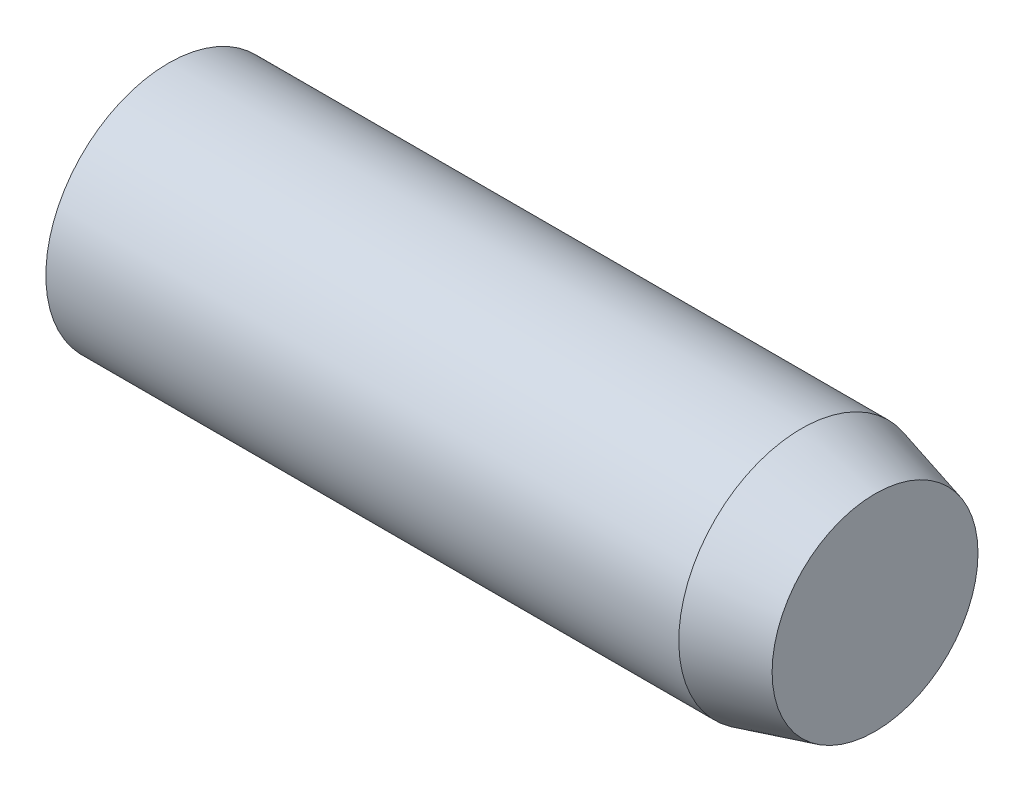
ISO-10303-21;
HEADER;
FILE_DESCRIPTION(('STEP AP214'),'2;1');
FILE_NAME('part.step','',(''),(''),'','','');
FILE_SCHEMA(('AUTOMOTIVE_DESIGN { 1 0 10303 214 1 1 1 1 }'));
ENDSEC;
DATA;
#1=APPLICATION_CONTEXT('core data for automotive mechanical design processes');
#2=APPLICATION_PROTOCOL_DEFINITION('international standard','automotive_design',2000,#1);
#3=PRODUCT_CONTEXT('',#1,'mechanical');
#4=PRODUCT('Part','Part','',(#3));
#5=PRODUCT_RELATED_PRODUCT_CATEGORY('part','',(#4));
#6=PRODUCT_DEFINITION_FORMATION('','',#4);
#7=PRODUCT_DEFINITION_CONTEXT('part definition',#1,'design');
#8=PRODUCT_DEFINITION('design','',#6,#7);
#9=PRODUCT_DEFINITION_SHAPE('','',#8);
#10=(LENGTH_UNIT() NAMED_UNIT(*) SI_UNIT(.MILLI.,.METRE.));
#11=(NAMED_UNIT(*) PLANE_ANGLE_UNIT() SI_UNIT($,.RADIAN.));
#12=(NAMED_UNIT(*) SI_UNIT($,.STERADIAN.) SOLID_ANGLE_UNIT());
#13=UNCERTAINTY_MEASURE_WITH_UNIT(LENGTH_MEASURE(1.E-05),#10,'distance_accuracy_value','');
#14=(GEOMETRIC_REPRESENTATION_CONTEXT(3) GLOBAL_UNCERTAINTY_ASSIGNED_CONTEXT((#13)) GLOBAL_UNIT_ASSIGNED_CONTEXT((#10,
#11,#12)) REPRESENTATION_CONTEXT('',''));
#15=CARTESIAN_POINT('',(0.,0.,0.));
#16=DIRECTION('',(0.,0.,1.));
#17=DIRECTION('',(1.,0.,0.));
#18=AXIS2_PLACEMENT_3D('',#15,#16,#17);
#19=CARTESIAN_POINT('',(30.,4.19615242270663,0.));
#20=DIRECTION('',(-1.,0.,0.));
#21=DIRECTION('',(0.,-1.,0.));
#22=AXIS2_PLACEMENT_3D('',#19,#20,#21);
#23=PLANE('',#22);
#24=CARTESIAN_POINT('',(30.,0.,0.));
#25=DIRECTION('',(-1.,0.,0.));
#26=DIRECTION('',(0.,-1.,0.));
#27=AXIS2_PLACEMENT_3D('',#24,#25,#26);
#28=CIRCLE('',#27,4.19615242270663);
#29=CARTESIAN_POINT('',(30.,-4.19615242270663,0.));
#30=VERTEX_POINT('',#29);
#31=EDGE_CURVE('E10',#30,#30,#28,.T.);
#32=ORIENTED_EDGE('',*,*,#31,.F.);
#33=EDGE_LOOP('',(#32));
#34=FACE_BOUND('',#33,.T.);
#35=ADVANCED_FACE('F30',(#34),#23,.F.);
#36=CARTESIAN_POINT('',(30.,0.,0.));
#37=DIRECTION('',(-1.,0.,0.));
#38=DIRECTION('',(0.,-1.,0.));
#39=AXIS2_PLACEMENT_3D('',#36,#37,#38);
#40=CONICAL_SURFACE('',#39,4.19615242270663,0.26179938779915);
#41=CARTESIAN_POINT('',(27.,0.,0.));
#42=DIRECTION('',(-1.,0.,0.));
#43=DIRECTION('',(0.,-1.,0.));
#44=AXIS2_PLACEMENT_3D('',#41,#42,#43);
#45=CIRCLE('',#44,5.);
#46=CARTESIAN_POINT('',(27.,-5.,0.));
#47=VERTEX_POINT('',#46);
#48=EDGE_CURVE('E36',#47,#47,#45,.T.);
#49=ORIENTED_EDGE('',*,*,#48,.F.);
#50=EDGE_LOOP('',(#49));
#51=FACE_BOUND('',#50,.T.);
#52=ORIENTED_EDGE('',*,*,#31,.T.);
#53=EDGE_LOOP('',(#52));
#54=FACE_BOUND('',#53,.T.);
#55=ADVANCED_FACE('F51',(#51,#54),#40,.T.);
#56=CARTESIAN_POINT('',(0.,0.,0.));
#57=DIRECTION('',(-1.,0.,0.));
#58=DIRECTION('',(0.,-1.,0.));
#59=AXIS2_PLACEMENT_3D('',#56,#57,#58);
#60=CYLINDRICAL_SURFACE('',#59,5.);
#61=CARTESIAN_POINT('',(1.2,0.,0.));
#62=DIRECTION('',(-1.,0.,0.));
#63=DIRECTION('',(0.,-1.,0.));
#64=AXIS2_PLACEMENT_3D('',#61,#62,#63);
#65=CIRCLE('',#64,5.);
#66=CARTESIAN_POINT('',(1.2,-5.,0.));
#67=VERTEX_POINT('',#66);
#68=EDGE_CURVE('E40',#67,#67,#65,.T.);
#69=ORIENTED_EDGE('',*,*,#68,.F.);
#70=EDGE_LOOP('',(#69));
#71=FACE_BOUND('',#70,.T.);
#72=ORIENTED_EDGE('',*,*,#48,.T.);
#73=EDGE_LOOP('',(#72));
#74=FACE_BOUND('',#73,.T.);
#75=ADVANCED_FACE('F49',(#71,#74),#60,.T.);
#76=CARTESIAN_POINT('',(11.0166666666667,0.,0.));
#77=DIRECTION('',(-1.,0.,0.));
#78=DIRECTION('',(0.,1.,0.));
#79=AXIS2_PLACEMENT_3D('',#76,#77,#78);
#80=SPHERICAL_SURFACE('',#79,11.0166666666667);
#81=ORIENTED_EDGE('',*,*,#68,.T.);
#82=EDGE_LOOP('',(#81));
#83=FACE_BOUND('',#82,.T.);
#84=ADVANCED_FACE('F47',(#83),#80,.T.);
#85=CLOSED_SHELL('',(#35,#55,#75,#84));
#86=MANIFOLD_SOLID_BREP('B2',#85);
#87=ADVANCED_BREP_SHAPE_REPRESENTATION('',(#18,#86),#14);
#88=SHAPE_DEFINITION_REPRESENTATION(#9,#87);
ENDSEC;
END-ISO-10303-21;
